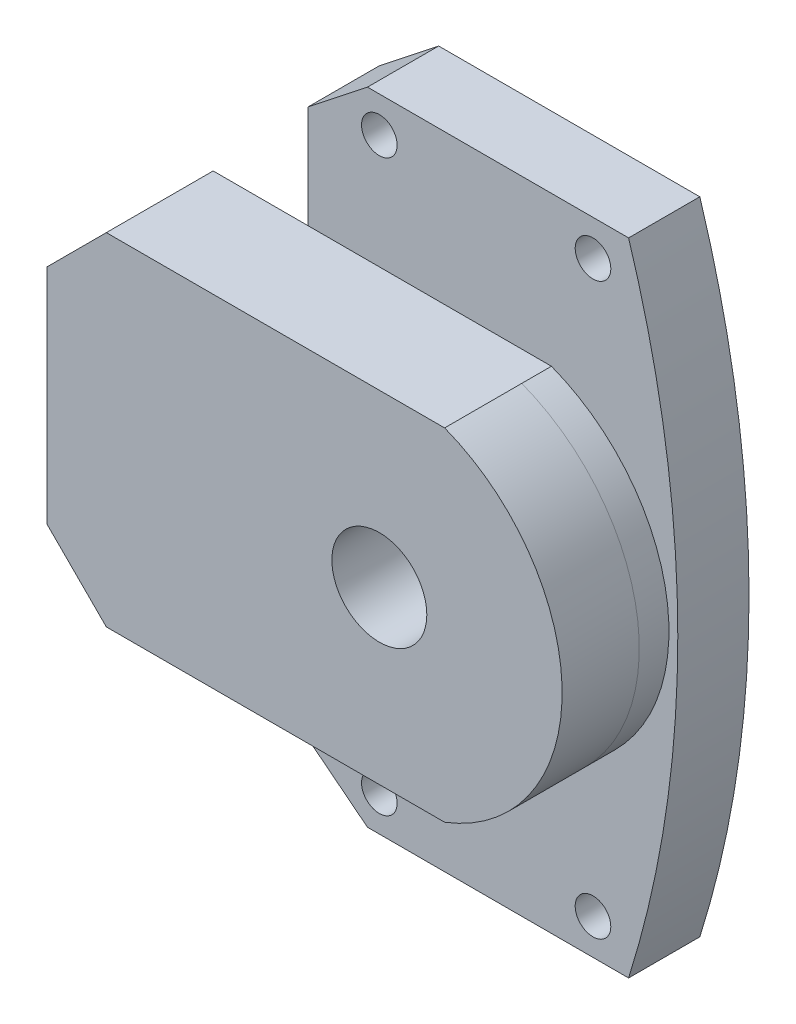
ISO-10303-21;
HEADER;
FILE_DESCRIPTION(('STEP AP214'),'2;1');
FILE_NAME('part.step','',(''),(''),'','','');
FILE_SCHEMA(('AUTOMOTIVE_DESIGN { 1 0 10303 214 1 1 1 1 }'));
ENDSEC;
DATA;
#1=APPLICATION_CONTEXT('core data for automotive mechanical design processes');
#2=APPLICATION_PROTOCOL_DEFINITION('international standard','automotive_design',2000,#1);
#3=PRODUCT_CONTEXT('',#1,'mechanical');
#4=PRODUCT('Part','Part','',(#3));
#5=PRODUCT_RELATED_PRODUCT_CATEGORY('part','',(#4));
#6=PRODUCT_DEFINITION_FORMATION('','',#4);
#7=PRODUCT_DEFINITION_CONTEXT('part definition',#1,'design');
#8=PRODUCT_DEFINITION('design','',#6,#7);
#9=PRODUCT_DEFINITION_SHAPE('','',#8);
#10=(LENGTH_UNIT() NAMED_UNIT(*) SI_UNIT(.MILLI.,.METRE.));
#11=(NAMED_UNIT(*) PLANE_ANGLE_UNIT() SI_UNIT($,.RADIAN.));
#12=(NAMED_UNIT(*) SI_UNIT($,.STERADIAN.) SOLID_ANGLE_UNIT());
#13=UNCERTAINTY_MEASURE_WITH_UNIT(LENGTH_MEASURE(1.E-05),#10,'distance_accuracy_value','');
#14=(GEOMETRIC_REPRESENTATION_CONTEXT(3) GLOBAL_UNCERTAINTY_ASSIGNED_CONTEXT((#13)) GLOBAL_UNIT_ASSIGNED_CONTEXT((#10,
#11,#12)) REPRESENTATION_CONTEXT('',''));
#15=CARTESIAN_POINT('',(0.,0.,0.));
#16=DIRECTION('',(0.,0.,1.));
#17=DIRECTION('',(1.,0.,0.));
#18=AXIS2_PLACEMENT_3D('',#15,#16,#17);
#19=CARTESIAN_POINT('',(-87.5169435511757,-10.5980462863294,-6.));
#20=DIRECTION('',(0.,0.,-1.));
#21=DIRECTION('',(-1.,0.,0.));
#22=AXIS2_PLACEMENT_3D('',#19,#20,#21);
#23=PLANE('',#22);
#24=CARTESIAN_POINT('',(-4.66241542365062,-34.5980462863294,-6.));
#25=DIRECTION('',(0.,0.,-1.));
#26=DIRECTION('',(1.,0.,0.));
#27=AXIS2_PLACEMENT_3D('',#24,#25,#26);
#28=CIRCLE('',#27,1.5);
#29=CARTESIAN_POINT('',(-3.16241542365062,-34.5980462863294,-6.));
#30=VERTEX_POINT('',#29);
#31=EDGE_CURVE('E207',#30,#30,#28,.T.);
#32=ORIENTED_EDGE('',*,*,#31,.F.);
#33=EDGE_LOOP('',(#32));
#34=FACE_BOUND('',#33,.T.);
#35=CARTESIAN_POINT('',(-4.66241542365062,13.4019537136706,-6.));
#36=DIRECTION('',(0.,0.,-1.));
#37=DIRECTION('',(-1.,0.,0.));
#38=AXIS2_PLACEMENT_3D('',#35,#36,#37);
#39=CIRCLE('',#38,1.5);
#40=CARTESIAN_POINT('',(-6.16241542365062,13.4019537136706,-6.));
#41=VERTEX_POINT('',#40);
#42=EDGE_CURVE('E219',#41,#41,#39,.T.);
#43=ORIENTED_EDGE('',*,*,#42,.F.);
#44=EDGE_LOOP('',(#43));
#45=FACE_BOUND('',#44,.T.);
#46=DIRECTION('',(-0.785278343538107,0.619142893983325,0.));
#47=VECTOR('',#46,1.);
#48=CARTESIAN_POINT('',(-28.6624154236506,-33.6558587863294,-6.));
#49=LINE('',#48,#47);
#50=CARTESIAN_POINT('',(-23.6624154236506,-37.5980462863294,-6.));
#51=VERTEX_POINT('',#50);
#52=CARTESIAN_POINT('',(-28.6624154236506,-33.6558587863294,-6.));
#53=VERTEX_POINT('',#52);
#54=EDGE_CURVE('E143',#51,#53,#49,.T.);
#55=ORIENTED_EDGE('',*,*,#54,.T.);
#56=DIRECTION('',(0.,1.,0.));
#57=VECTOR('',#56,1.);
#58=CARTESIAN_POINT('',(-28.6624154236506,12.4597662136706,-6.));
#59=LINE('',#58,#57);
#60=CARTESIAN_POINT('',(-28.6624154236506,12.4597662136706,-6.));
#61=VERTEX_POINT('',#60);
#62=EDGE_CURVE('E101',#53,#61,#59,.T.);
#63=ORIENTED_EDGE('',*,*,#62,.T.);
#64=DIRECTION('',(0.785278343538107,0.619142893983325,0.));
#65=VECTOR('',#64,1.);
#66=CARTESIAN_POINT('',(-23.6624154236506,16.4019537136706,-6.));
#67=LINE('',#66,#65);
#68=CARTESIAN_POINT('',(-23.6624154236506,16.4019537136706,-6.));
#69=VERTEX_POINT('',#68);
#70=EDGE_CURVE('E114',#61,#69,#67,.T.);
#71=ORIENTED_EDGE('',*,*,#70,.T.);
#72=DIRECTION('',(1.,0.,0.));
#73=VECTOR('',#72,1.);
#74=CARTESIAN_POINT('',(-23.6624154236506,16.4019537136706,-6.));
#75=LINE('',#74,#73);
#76=CARTESIAN_POINT('',(-1.66241542365062,16.4019537136706,-6.));
#77=VERTEX_POINT('',#76);
#78=EDGE_CURVE('E108',#69,#77,#75,.T.);
#79=ORIENTED_EDGE('',*,*,#78,.T.);
#80=CARTESIAN_POINT('',(-87.5169435511757,-10.5980462863294,-6.));
#81=DIRECTION('',(0.,0.,-1.));
#82=DIRECTION('',(-1.,0.,0.));
#83=AXIS2_PLACEMENT_3D('',#80,#81,#82);
#84=CIRCLE('',#83,90.);
#85=CARTESIAN_POINT('',(-1.66241542365062,-37.5980462863294,-6.));
#86=VERTEX_POINT('',#85);
#87=EDGE_CURVE('E112',#77,#86,#84,.T.);
#88=ORIENTED_EDGE('',*,*,#87,.T.);
#89=DIRECTION('',(-1.,0.,0.));
#90=VECTOR('',#89,1.);
#91=CARTESIAN_POINT('',(-23.6624154236506,-37.5980462863294,-6.));
#92=LINE('',#91,#90);
#93=EDGE_CURVE('E64',#86,#51,#92,.T.);
#94=ORIENTED_EDGE('',*,*,#93,.T.);
#95=EDGE_LOOP('',(#55,#63,#71,#79,#88,#94));
#96=FACE_BOUND('',#95,.T.);
#97=CARTESIAN_POINT('',(-13.6624154236506,-10.5980462863294,-6.));
#98=DIRECTION('',(0.,0.,-1.));
#99=DIRECTION('',(-1.,0.,0.));
#100=AXIS2_PLACEMENT_3D('',#97,#98,#99);
#101=CIRCLE('',#100,10.);
#102=CARTESIAN_POINT('',(-23.6624154236506,-10.5980462863294,-6.));
#103=VERTEX_POINT('',#102);
#104=EDGE_CURVE('E136',#103,#103,#101,.T.);
#105=ORIENTED_EDGE('',*,*,#104,.F.);
#106=EDGE_LOOP('',(#105));
#107=FACE_BOUND('',#106,.T.);
#108=CARTESIAN_POINT('',(-22.6624154236506,13.4019537136706,-6.));
#109=DIRECTION('',(0.,0.,-1.));
#110=DIRECTION('',(1.,0.,0.));
#111=AXIS2_PLACEMENT_3D('',#108,#109,#110);
#112=CIRCLE('',#111,1.5);
#113=CARTESIAN_POINT('',(-21.1624154236506,13.4019537136706,-6.));
#114=VERTEX_POINT('',#113);
#115=EDGE_CURVE('E213',#114,#114,#112,.T.);
#116=ORIENTED_EDGE('',*,*,#115,.F.);
#117=EDGE_LOOP('',(#116));
#118=FACE_BOUND('',#117,.T.);
#119=CARTESIAN_POINT('',(-22.6624154236506,-34.5980462863294,-6.));
#120=DIRECTION('',(0.,0.,-1.));
#121=DIRECTION('',(-1.,0.,0.));
#122=AXIS2_PLACEMENT_3D('',#119,#120,#121);
#123=CIRCLE('',#122,1.5);
#124=CARTESIAN_POINT('',(-24.1624154236506,-34.5980462863294,-6.));
#125=VERTEX_POINT('',#124);
#126=EDGE_CURVE('E198',#125,#125,#123,.T.);
#127=ORIENTED_EDGE('',*,*,#126,.F.);
#128=EDGE_LOOP('',(#127));
#129=FACE_BOUND('',#128,.T.);
#130=ADVANCED_FACE('F47',(#34,#45,#96,#107,#118,#129),#23,.T.);
#131=CARTESIAN_POINT('',(-87.5169435511757,-10.5980462863294,0.));
#132=DIRECTION('',(0.,0.,-1.));
#133=DIRECTION('',(-1.,0.,0.));
#134=AXIS2_PLACEMENT_3D('',#131,#132,#133);
#135=PLANE('',#134);
#136=DIRECTION('',(-0.785278343538107,0.619142893983325,0.));
#137=VECTOR('',#136,1.);
#138=CARTESIAN_POINT('',(-28.6624154236506,-33.6558587863294,0.));
#139=LINE('',#138,#137);
#140=CARTESIAN_POINT('',(-23.6624154236506,-37.5980462863294,0.));
#141=VERTEX_POINT('',#140);
#142=CARTESIAN_POINT('',(-28.6624154236506,-33.6558587863294,0.));
#143=VERTEX_POINT('',#142);
#144=EDGE_CURVE('E132',#141,#143,#139,.T.);
#145=ORIENTED_EDGE('',*,*,#144,.F.);
#146=DIRECTION('',(-1.,0.,0.));
#147=VECTOR('',#146,1.);
#148=CARTESIAN_POINT('',(-23.6624154236506,-37.5980462863294,0.));
#149=LINE('',#148,#147);
#150=CARTESIAN_POINT('',(-1.66241542365062,-37.5980462863294,0.));
#151=VERTEX_POINT('',#150);
#152=EDGE_CURVE('E93',#151,#141,#149,.T.);
#153=ORIENTED_EDGE('',*,*,#152,.F.);
#154=CARTESIAN_POINT('',(-87.5169435511757,-10.5980462863294,0.));
#155=DIRECTION('',(0.,0.,-1.));
#156=DIRECTION('',(-1.,0.,0.));
#157=AXIS2_PLACEMENT_3D('',#154,#155,#156);
#158=CIRCLE('',#157,90.);
#159=CARTESIAN_POINT('',(-1.66241542365062,16.4019537136706,0.));
#160=VERTEX_POINT('',#159);
#161=EDGE_CURVE('E87',#160,#151,#158,.T.);
#162=ORIENTED_EDGE('',*,*,#161,.F.);
#163=DIRECTION('',(1.,0.,0.));
#164=VECTOR('',#163,1.);
#165=CARTESIAN_POINT('',(-23.6624154236506,16.4019537136706,0.));
#166=LINE('',#165,#164);
#167=CARTESIAN_POINT('',(-23.6624154236506,16.4019537136706,0.));
#168=VERTEX_POINT('',#167);
#169=EDGE_CURVE('E122',#168,#160,#166,.T.);
#170=ORIENTED_EDGE('',*,*,#169,.F.);
#171=DIRECTION('',(0.785278343538107,0.619142893983325,0.));
#172=VECTOR('',#171,1.);
#173=CARTESIAN_POINT('',(-23.6624154236506,16.4019537136706,0.));
#174=LINE('',#173,#172);
#175=CARTESIAN_POINT('',(-28.6624154236506,12.4597662136706,0.));
#176=VERTEX_POINT('',#175);
#177=EDGE_CURVE('E138',#176,#168,#174,.T.);
#178=ORIENTED_EDGE('',*,*,#177,.F.);
#179=DIRECTION('',(0.,1.,0.));
#180=VECTOR('',#179,1.);
#181=CARTESIAN_POINT('',(-28.6624154236506,12.4597662136706,0.));
#182=LINE('',#181,#180);
#183=EDGE_CURVE('E135',#143,#176,#182,.T.);
#184=ORIENTED_EDGE('',*,*,#183,.F.);
#185=EDGE_LOOP('',(#145,#153,#162,#170,#178,#184));
#186=FACE_BOUND('',#185,.T.);
#187=CARTESIAN_POINT('',(-13.6624154236506,-10.5980462863294,0.));
#188=DIRECTION('',(0.,0.,-1.));
#189=DIRECTION('',(-1.,0.,0.));
#190=AXIS2_PLACEMENT_3D('',#187,#188,#189);
#191=CIRCLE('',#190,10.);
#192=CARTESIAN_POINT('',(-23.6624154236506,-10.5980462863294,0.));
#193=VERTEX_POINT('',#192);
#194=EDGE_CURVE('E222',#193,#193,#191,.T.);
#195=ORIENTED_EDGE('',*,*,#194,.T.);
#196=EDGE_LOOP('',(#195));
#197=FACE_BOUND('',#196,.T.);
#198=CARTESIAN_POINT('',(-4.66241542365062,13.4019537136706,0.));
#199=DIRECTION('',(0.,0.,-1.));
#200=DIRECTION('',(-1.,0.,0.));
#201=AXIS2_PLACEMENT_3D('',#198,#199,#200);
#202=CIRCLE('',#201,1.5);
#203=CARTESIAN_POINT('',(-6.16241542365062,13.4019537136706,0.));
#204=VERTEX_POINT('',#203);
#205=EDGE_CURVE('E216',#204,#204,#202,.T.);
#206=ORIENTED_EDGE('',*,*,#205,.T.);
#207=EDGE_LOOP('',(#206));
#208=FACE_BOUND('',#207,.T.);
#209=CARTESIAN_POINT('',(-22.6624154236506,13.4019537136706,0.));
#210=DIRECTION('',(0.,0.,-1.));
#211=DIRECTION('',(1.,0.,0.));
#212=AXIS2_PLACEMENT_3D('',#209,#210,#211);
#213=CIRCLE('',#212,1.5);
#214=CARTESIAN_POINT('',(-21.1624154236506,13.4019537136706,0.));
#215=VERTEX_POINT('',#214);
#216=EDGE_CURVE('E210',#215,#215,#213,.T.);
#217=ORIENTED_EDGE('',*,*,#216,.T.);
#218=EDGE_LOOP('',(#217));
#219=FACE_BOUND('',#218,.T.);
#220=CARTESIAN_POINT('',(-4.66241542365062,-34.5980462863294,0.));
#221=DIRECTION('',(0.,0.,-1.));
#222=DIRECTION('',(1.,0.,0.));
#223=AXIS2_PLACEMENT_3D('',#220,#221,#222);
#224=CIRCLE('',#223,1.5);
#225=CARTESIAN_POINT('',(-3.16241542365062,-34.5980462863294,0.));
#226=VERTEX_POINT('',#225);
#227=EDGE_CURVE('E204',#226,#226,#224,.T.);
#228=ORIENTED_EDGE('',*,*,#227,.T.);
#229=EDGE_LOOP('',(#228));
#230=FACE_BOUND('',#229,.T.);
#231=CARTESIAN_POINT('',(-22.6624154236506,-34.5980462863294,0.));
#232=DIRECTION('',(0.,0.,-1.));
#233=DIRECTION('',(-1.,0.,0.));
#234=AXIS2_PLACEMENT_3D('',#231,#232,#233);
#235=CIRCLE('',#234,1.5);
#236=CARTESIAN_POINT('',(-24.1624154236506,-34.5980462863294,0.));
#237=VERTEX_POINT('',#236);
#238=EDGE_CURVE('E201',#237,#237,#235,.T.);
#239=ORIENTED_EDGE('',*,*,#238,.T.);
#240=EDGE_LOOP('',(#239));
#241=FACE_BOUND('',#240,.T.);
#242=ADVANCED_FACE('F152',(#186,#197,#208,#219,#230,#241),#135,.F.);
#243=CARTESIAN_POINT('',(-28.6624154236506,-33.6558587863294,-6.));
#244=DIRECTION('',(0.619142893983325,0.785278343538107,0.));
#245=DIRECTION('',(-0.785278343538107,0.619142893983325,0.));
#246=AXIS2_PLACEMENT_3D('',#243,#244,#245);
#247=PLANE('',#246);
#248=ORIENTED_EDGE('',*,*,#144,.T.);
#249=DIRECTION('',(0.,0.,1.));
#250=VECTOR('',#249,1.);
#251=CARTESIAN_POINT('',(-28.6624154236506,-33.6558587863294,-6.));
#252=LINE('',#251,#250);
#253=EDGE_CURVE('E12',#53,#143,#252,.T.);
#254=ORIENTED_EDGE('',*,*,#253,.F.);
#255=ORIENTED_EDGE('',*,*,#54,.F.);
#256=DIRECTION('',(0.,0.,1.));
#257=VECTOR('',#256,1.);
#258=CARTESIAN_POINT('',(-23.6624154236506,-37.5980462863294,-6.));
#259=LINE('',#258,#257);
#260=EDGE_CURVE('E128',#51,#141,#259,.T.);
#261=ORIENTED_EDGE('',*,*,#260,.T.);
#262=EDGE_LOOP('',(#248,#254,#255,#261));
#263=FACE_BOUND('',#262,.T.);
#264=ADVANCED_FACE('F49',(#263),#247,.F.);
#265=CARTESIAN_POINT('',(-28.6624154236506,12.4597662136706,-6.));
#266=DIRECTION('',(1.,0.,0.));
#267=DIRECTION('',(0.,1.,0.));
#268=AXIS2_PLACEMENT_3D('',#265,#266,#267);
#269=PLANE('',#268);
#270=ORIENTED_EDGE('',*,*,#183,.T.);
#271=DIRECTION('',(0.,0.,1.));
#272=VECTOR('',#271,1.);
#273=CARTESIAN_POINT('',(-28.6624154236506,12.4597662136706,-6.));
#274=LINE('',#273,#272);
#275=EDGE_CURVE('E56',#61,#176,#274,.T.);
#276=ORIENTED_EDGE('',*,*,#275,.F.);
#277=ORIENTED_EDGE('',*,*,#62,.F.);
#278=ORIENTED_EDGE('',*,*,#253,.T.);
#279=EDGE_LOOP('',(#270,#276,#277,#278));
#280=FACE_BOUND('',#279,.T.);
#281=ADVANCED_FACE('F289',(#280),#269,.F.);
#282=CARTESIAN_POINT('',(-23.6624154236506,16.4019537136706,-6.));
#283=DIRECTION('',(0.619142893983325,-0.785278343538107,0.));
#284=DIRECTION('',(0.785278343538107,0.619142893983325,0.));
#285=AXIS2_PLACEMENT_3D('',#282,#283,#284);
#286=PLANE('',#285);
#287=ORIENTED_EDGE('',*,*,#177,.T.);
#288=DIRECTION('',(0.,0.,1.));
#289=VECTOR('',#288,1.);
#290=CARTESIAN_POINT('',(-23.6624154236506,16.4019537136706,-6.));
#291=LINE('',#290,#289);
#292=EDGE_CURVE('E123',#69,#168,#291,.T.);
#293=ORIENTED_EDGE('',*,*,#292,.F.);
#294=ORIENTED_EDGE('',*,*,#70,.F.);
#295=ORIENTED_EDGE('',*,*,#275,.T.);
#296=EDGE_LOOP('',(#287,#293,#294,#295));
#297=FACE_BOUND('',#296,.T.);
#298=ADVANCED_FACE('F149',(#297),#286,.F.);
#299=CARTESIAN_POINT('',(-23.6624154236506,16.4019537136706,-6.));
#300=DIRECTION('',(0.,-1.,0.));
#301=DIRECTION('',(1.,0.,0.));
#302=AXIS2_PLACEMENT_3D('',#299,#300,#301);
#303=PLANE('',#302);
#304=ORIENTED_EDGE('',*,*,#169,.T.);
#305=DIRECTION('',(0.,0.,1.));
#306=VECTOR('',#305,1.);
#307=CARTESIAN_POINT('',(-1.66241542365062,16.4019537136706,-6.));
#308=LINE('',#307,#306);
#309=EDGE_CURVE('E119',#77,#160,#308,.T.);
#310=ORIENTED_EDGE('',*,*,#309,.F.);
#311=ORIENTED_EDGE('',*,*,#78,.F.);
#312=ORIENTED_EDGE('',*,*,#292,.T.);
#313=EDGE_LOOP('',(#304,#310,#311,#312));
#314=FACE_BOUND('',#313,.T.);
#315=ADVANCED_FACE('F120',(#314),#303,.F.);
#316=CARTESIAN_POINT('',(-87.5169435511757,-10.5980462863294,-6.));
#317=DIRECTION('',(0.,0.,1.));
#318=DIRECTION('',(1.,0.,0.));
#319=AXIS2_PLACEMENT_3D('',#316,#317,#318);
#320=CYLINDRICAL_SURFACE('',#319,90.);
#321=ORIENTED_EDGE('',*,*,#161,.T.);
#322=DIRECTION('',(0.,0.,1.));
#323=VECTOR('',#322,1.);
#324=CARTESIAN_POINT('',(-1.66241542365062,-37.5980462863294,-6.));
#325=LINE('',#324,#323);
#326=EDGE_CURVE('E124',#86,#151,#325,.T.);
#327=ORIENTED_EDGE('',*,*,#326,.F.);
#328=ORIENTED_EDGE('',*,*,#87,.F.);
#329=ORIENTED_EDGE('',*,*,#309,.T.);
#330=EDGE_LOOP('',(#321,#327,#328,#329));
#331=FACE_BOUND('',#330,.T.);
#332=ADVANCED_FACE('F126',(#331),#320,.T.);
#333=CARTESIAN_POINT('',(-23.6624154236506,-37.5980462863294,-6.));
#334=DIRECTION('',(0.,1.,0.));
#335=DIRECTION('',(-1.,0.,0.));
#336=AXIS2_PLACEMENT_3D('',#333,#334,#335);
#337=PLANE('',#336);
#338=ORIENTED_EDGE('',*,*,#152,.T.);
#339=ORIENTED_EDGE('',*,*,#260,.F.);
#340=ORIENTED_EDGE('',*,*,#93,.F.);
#341=ORIENTED_EDGE('',*,*,#326,.T.);
#342=EDGE_LOOP('',(#338,#339,#340,#341));
#343=FACE_BOUND('',#342,.T.);
#344=ADVANCED_FACE('F157',(#343),#337,.F.);
#345=CARTESIAN_POINT('',(-13.6624154236506,-10.5980462863294,-6.));
#346=DIRECTION('',(0.,0.,1.));
#347=DIRECTION('',(1.,0.,0.));
#348=AXIS2_PLACEMENT_3D('',#345,#346,#347);
#349=CYLINDRICAL_SURFACE('',#348,10.);
#350=ORIENTED_EDGE('',*,*,#104,.T.);
#351=EDGE_LOOP('',(#350));
#352=FACE_BOUND('',#351,.T.);
#353=ORIENTED_EDGE('',*,*,#194,.F.);
#354=EDGE_LOOP('',(#353));
#355=FACE_BOUND('',#354,.T.);
#356=ADVANCED_FACE('F159',(#352,#355),#349,.F.);
#357=CARTESIAN_POINT('',(-4.66241542365062,13.4019537136706,-6.));
#358=DIRECTION('',(0.,0.,1.));
#359=DIRECTION('',(1.,0.,0.));
#360=AXIS2_PLACEMENT_3D('',#357,#358,#359);
#361=CYLINDRICAL_SURFACE('',#360,1.5);
#362=ORIENTED_EDGE('',*,*,#42,.T.);
#363=EDGE_LOOP('',(#362));
#364=FACE_BOUND('',#363,.T.);
#365=ORIENTED_EDGE('',*,*,#205,.F.);
#366=EDGE_LOOP('',(#365));
#367=FACE_BOUND('',#366,.T.);
#368=ADVANCED_FACE('F165',(#364,#367),#361,.F.);
#369=CARTESIAN_POINT('',(-22.6624154236506,13.4019537136706,-6.));
#370=DIRECTION('',(0.,0.,1.));
#371=DIRECTION('',(1.,0.,0.));
#372=AXIS2_PLACEMENT_3D('',#369,#370,#371);
#373=CYLINDRICAL_SURFACE('',#372,1.5);
#374=ORIENTED_EDGE('',*,*,#115,.T.);
#375=EDGE_LOOP('',(#374));
#376=FACE_BOUND('',#375,.T.);
#377=ORIENTED_EDGE('',*,*,#216,.F.);
#378=EDGE_LOOP('',(#377));
#379=FACE_BOUND('',#378,.T.);
#380=ADVANCED_FACE('F181',(#376,#379),#373,.F.);
#381=CARTESIAN_POINT('',(-4.66241542365062,-34.5980462863294,-6.));
#382=DIRECTION('',(0.,0.,1.));
#383=DIRECTION('',(1.,0.,0.));
#384=AXIS2_PLACEMENT_3D('',#381,#382,#383);
#385=CYLINDRICAL_SURFACE('',#384,1.5);
#386=ORIENTED_EDGE('',*,*,#31,.T.);
#387=EDGE_LOOP('',(#386));
#388=FACE_BOUND('',#387,.T.);
#389=ORIENTED_EDGE('',*,*,#227,.F.);
#390=EDGE_LOOP('',(#389));
#391=FACE_BOUND('',#390,.T.);
#392=ADVANCED_FACE('F185',(#388,#391),#385,.F.);
#393=CARTESIAN_POINT('',(-22.6624154236506,-34.5980462863294,-6.));
#394=DIRECTION('',(0.,0.,1.));
#395=DIRECTION('',(1.,0.,0.));
#396=AXIS2_PLACEMENT_3D('',#393,#394,#395);
#397=CYLINDRICAL_SURFACE('',#396,1.5);
#398=ORIENTED_EDGE('',*,*,#126,.T.);
#399=EDGE_LOOP('',(#398));
#400=FACE_BOUND('',#399,.T.);
#401=ORIENTED_EDGE('',*,*,#238,.F.);
#402=EDGE_LOOP('',(#401));
#403=FACE_BOUND('',#402,.T.);
#404=ADVANCED_FACE('F189',(#400,#403),#397,.F.);
#405=CLOSED_SHELL('',(#130,#242,#264,#281,#298,#315,#332,#344,#356,#368,#380,#392,#404));
#406=MANIFOLD_SOLID_BREP('B2',#405);
#407=CARTESIAN_POINT('',(-13.6624154236506,-10.5980462863294,1.74455679792347E-13));
#408=DIRECTION('',(0.,0.,1.));
#409=DIRECTION('',(1.,0.,0.));
#410=AXIS2_PLACEMENT_3D('',#407,#408,#409);
#411=PLANE('',#410);
#412=DIRECTION('',(-0.707106781186547,-0.707106781186548,0.));
#413=VECTOR('',#412,1.);
#414=CARTESIAN_POINT('',(-36.6624154236506,3.78695371367061,1.74455679792347E-13));
#415=LINE('',#414,#413);
#416=CARTESIAN_POINT('',(-36.6624154236506,3.78695371367061,1.74455679792347E-13));
#417=VERTEX_POINT('',#416);
#418=CARTESIAN_POINT('',(-41.6624154236506,-1.21304628632939,1.74455679792347E-13));
#419=VERTEX_POINT('',#418);
#420=EDGE_CURVE('E387',#417,#419,#415,.T.);
#421=ORIENTED_EDGE('',*,*,#420,.F.);
#422=DIRECTION('',(-1.,0.,0.));
#423=VECTOR('',#422,1.);
#424=CARTESIAN_POINT('',(-19.1624154236506,3.78695371367061,1.74455679792347E-13));
#425=LINE('',#424,#423);
#426=CARTESIAN_POINT('',(-8.16241542365062,3.78695371367061,1.74455679792347E-13));
#427=VERTEX_POINT('',#426);
#428=EDGE_CURVE('E371',#427,#417,#425,.T.);
#429=ORIENTED_EDGE('',*,*,#428,.F.);
#430=CARTESIAN_POINT('',(-13.6624154236506,-10.5980462863294,1.74455679792347E-13));
#431=DIRECTION('',(0.,0.,1.));
#432=DIRECTION('',(1.,0.,0.));
#433=AXIS2_PLACEMENT_3D('',#430,#431,#432);
#434=CIRCLE('',#433,15.4005917094117);
#435=CARTESIAN_POINT('',(-8.16241542365062,-24.9830462863294,1.74455679792347E-13));
#436=VERTEX_POINT('',#435);
#437=EDGE_CURVE('E381',#436,#427,#434,.T.);
#438=ORIENTED_EDGE('',*,*,#437,.F.);
#439=DIRECTION('',(1.,0.,0.));
#440=VECTOR('',#439,1.);
#441=CARTESIAN_POINT('',(-19.1624154236506,-24.9830462863294,1.74455679792347E-13));
#442=LINE('',#441,#440);
#443=CARTESIAN_POINT('',(-36.6624154236506,-24.9830462863294,1.74455679792347E-13));
#444=VERTEX_POINT('',#443);
#445=EDGE_CURVE('E405',#444,#436,#442,.T.);
#446=ORIENTED_EDGE('',*,*,#445,.F.);
#447=DIRECTION('',(0.707106781186548,-0.707106781186547,0.));
#448=VECTOR('',#447,1.);
#449=CARTESIAN_POINT('',(-41.6624154236506,-19.9830462863294,1.74455679792347E-13));
#450=LINE('',#449,#448);
#451=CARTESIAN_POINT('',(-41.6624154236506,-19.9830462863294,1.74455679792347E-13));
#452=VERTEX_POINT('',#451);
#453=EDGE_CURVE('E396',#452,#444,#450,.T.);
#454=ORIENTED_EDGE('',*,*,#453,.F.);
#455=DIRECTION('',(0.,-1.,0.));
#456=VECTOR('',#455,1.);
#457=CARTESIAN_POINT('',(-41.6624154236506,-1.21304628632939,1.74455679792347E-13));
#458=LINE('',#457,#456);
#459=EDGE_CURVE('E393',#419,#452,#458,.T.);
#460=ORIENTED_EDGE('',*,*,#459,.F.);
#461=EDGE_LOOP('',(#421,#429,#438,#446,#454,#460));
#462=FACE_BOUND('',#461,.T.);
#463=CARTESIAN_POINT('',(-29.4124154236506,-21.0780462863294,1.74455679792347E-13));
#464=DIRECTION('',(0.,0.,1.));
#465=DIRECTION('',(1.,0.,0.));
#466=AXIS2_PLACEMENT_3D('',#463,#464,#465);
#467=CIRCLE('',#466,1.98);
#468=CARTESIAN_POINT('',(-27.4324154236506,-21.0780462863294,1.74455679792347E-13));
#469=VERTEX_POINT('',#468);
#470=EDGE_CURVE('E394',#469,#469,#467,.T.);
#471=ORIENTED_EDGE('',*,*,#470,.T.);
#472=EDGE_LOOP('',(#471));
#473=FACE_BOUND('',#472,.T.);
#474=CARTESIAN_POINT('',(-29.4124154236506,-0.118046286329387,1.74455679792347E-13));
#475=DIRECTION('',(0.,0.,1.));
#476=DIRECTION('',(1.,0.,0.));
#477=AXIS2_PLACEMENT_3D('',#474,#475,#476);
#478=CIRCLE('',#477,1.98);
#479=CARTESIAN_POINT('',(-27.4324154236506,-0.118046286329387,1.74455679792347E-13));
#480=VERTEX_POINT('',#479);
#481=EDGE_CURVE('E399',#480,#480,#478,.T.);
#482=ORIENTED_EDGE('',*,*,#481,.T.);
#483=EDGE_LOOP('',(#482));
#484=FACE_BOUND('',#483,.T.);
#485=CARTESIAN_POINT('',(-13.6624154236506,-10.5980462863294,1.74455679792347E-13));
#486=DIRECTION('',(0.,0.,1.));
#487=DIRECTION('',(1.,0.,0.));
#488=AXIS2_PLACEMENT_3D('',#485,#486,#487);
#489=CIRCLE('',#488,6.3);
#490=CARTESIAN_POINT('',(-7.36241542365062,-10.5980462863294,1.74455679792347E-13));
#491=VERTEX_POINT('',#490);
#492=EDGE_CURVE('E580',#491,#491,#489,.T.);
#493=ORIENTED_EDGE('',*,*,#492,.T.);
#494=EDGE_LOOP('',(#493));
#495=FACE_BOUND('',#494,.T.);
#496=CARTESIAN_POINT('',(-13.6624154236506,-1.07304628632939,1.74455679792347E-13));
#497=DIRECTION('',(0.,0.,1.));
#498=DIRECTION('',(1.,0.,0.));
#499=AXIS2_PLACEMENT_3D('',#496,#497,#498);
#500=CIRCLE('',#499,1.475);
#501=CARTESIAN_POINT('',(-12.1874154236506,-1.07304628632939,1.74455679792347E-13));
#502=VERTEX_POINT('',#501);
#503=EDGE_CURVE('E577',#502,#502,#500,.T.);
#504=ORIENTED_EDGE('',*,*,#503,.T.);
#505=EDGE_LOOP('',(#504));
#506=FACE_BOUND('',#505,.T.);
#507=CARTESIAN_POINT('',(-13.6624154236506,-20.1230462863294,1.74455679792347E-13));
#508=DIRECTION('',(0.,0.,1.));
#509=DIRECTION('',(1.,0.,0.));
#510=AXIS2_PLACEMENT_3D('',#507,#508,#509);
#511=CIRCLE('',#510,1.475);
#512=CARTESIAN_POINT('',(-12.1874154236506,-20.1230462863294,1.74455679792347E-13));
#513=VERTEX_POINT('',#512);
#514=EDGE_CURVE('E574',#513,#513,#511,.T.);
#515=ORIENTED_EDGE('',*,*,#514,.T.);
#516=EDGE_LOOP('',(#515));
#517=FACE_BOUND('',#516,.T.);
#518=CARTESIAN_POINT('',(-4.6821593025815,-19.5783024073986,1.74455679792347E-13));
#519=DIRECTION('',(0.,0.,1.));
#520=DIRECTION('',(1.,0.,0.));
#521=AXIS2_PLACEMENT_3D('',#518,#519,#520);
#522=CIRCLE('',#521,1.98000000000002);
#523=CARTESIAN_POINT('',(-2.70215930258148,-19.5783024073986,1.74455679792347E-13));
#524=VERTEX_POINT('',#523);
#525=EDGE_CURVE('E571',#524,#524,#522,.T.);
#526=ORIENTED_EDGE('',*,*,#525,.T.);
#527=EDGE_LOOP('',(#526));
#528=FACE_BOUND('',#527,.T.);
#529=CARTESIAN_POINT('',(-4.6821593025815,-1.61779016526022,1.74455679792347E-13));
#530=DIRECTION('',(0.,0.,1.));
#531=DIRECTION('',(1.,0.,0.));
#532=AXIS2_PLACEMENT_3D('',#529,#530,#531);
#533=CIRCLE('',#532,1.98000000000002);
#534=CARTESIAN_POINT('',(-2.70215930258148,-1.61779016526022,1.74455679792347E-13));
#535=VERTEX_POINT('',#534);
#536=EDGE_CURVE('E568',#535,#535,#533,.T.);
#537=ORIENTED_EDGE('',*,*,#536,.T.);
#538=EDGE_LOOP('',(#537));
#539=FACE_BOUND('',#538,.T.);
#540=CARTESIAN_POINT('',(-22.6426715447198,-1.61779016526022,1.74455679792347E-13));
#541=DIRECTION('',(0.,0.,1.));
#542=DIRECTION('',(1.,0.,0.));
#543=AXIS2_PLACEMENT_3D('',#540,#541,#542);
#544=CIRCLE('',#543,1.05);
#545=CARTESIAN_POINT('',(-21.5926715447198,-1.61779016526022,1.74455679792347E-13));
#546=VERTEX_POINT('',#545);
#547=EDGE_CURVE('E565',#546,#546,#544,.T.);
#548=ORIENTED_EDGE('',*,*,#547,.T.);
#549=EDGE_LOOP('',(#548));
#550=FACE_BOUND('',#549,.T.);
#551=CARTESIAN_POINT('',(-22.6426715447198,-19.5783024073986,1.74455679792347E-13));
#552=DIRECTION('',(0.,0.,1.));
#553=DIRECTION('',(1.,0.,0.));
#554=AXIS2_PLACEMENT_3D('',#551,#552,#553);
#555=CIRCLE('',#554,1.05);
#556=CARTESIAN_POINT('',(-21.5926715447198,-19.5783024073986,1.74455679792347E-13));
#557=VERTEX_POINT('',#556);
#558=EDGE_CURVE('E562',#557,#557,#555,.T.);
#559=ORIENTED_EDGE('',*,*,#558,.T.);
#560=EDGE_LOOP('',(#559));
#561=FACE_BOUND('',#560,.T.);
#562=CARTESIAN_POINT('',(-17.6624154236506,-3.66984305605386,1.74455679792347E-13));
#563=DIRECTION('',(0.,0.,1.));
#564=DIRECTION('',(1.,0.,0.));
#565=AXIS2_PLACEMENT_3D('',#562,#563,#564);
#566=CIRCLE('',#565,0.85);
#567=CARTESIAN_POINT('',(-16.8124154236506,-3.66984305605386,1.74455679792347E-13));
#568=VERTEX_POINT('',#567);
#569=EDGE_CURVE('E559',#568,#568,#566,.T.);
#570=ORIENTED_EDGE('',*,*,#569,.T.);
#571=EDGE_LOOP('',(#570));
#572=FACE_BOUND('',#571,.T.);
#573=CARTESIAN_POINT('',(-9.66241542365067,-17.5262495166049,1.74455679792347E-13));
#574=DIRECTION('',(0.,0.,1.));
#575=DIRECTION('',(1.,0.,0.));
#576=AXIS2_PLACEMENT_3D('',#573,#574,#575);
#577=CIRCLE('',#576,0.85);
#578=CARTESIAN_POINT('',(-8.81241542365067,-17.5262495166049,1.74455679792347E-13));
#579=VERTEX_POINT('',#578);
#580=EDGE_CURVE('E556',#579,#579,#577,.T.);
#581=ORIENTED_EDGE('',*,*,#580,.T.);
#582=EDGE_LOOP('',(#581));
#583=FACE_BOUND('',#582,.T.);
#584=ADVANCED_FACE('F328',(#462,#473,#484,#495,#506,#517,#528,#539,#550,#561,#572,#583),#411,.F.);
#585=CARTESIAN_POINT('',(-36.6624154236506,3.78695371367061,2.50000000000017));
#586=DIRECTION('',(0.707106781186548,-0.707106781186547,0.));
#587=DIRECTION('',(0.707106781186547,0.707106781186548,0.));
#588=AXIS2_PLACEMENT_3D('',#585,#586,#587);
#589=PLANE('',#588);
#590=ORIENTED_EDGE('',*,*,#420,.T.);
#591=DIRECTION('',(0.,0.,-1.));
#592=VECTOR('',#591,1.);
#593=CARTESIAN_POINT('',(-41.6624154236506,-1.21304628632939,2.50000000000017));
#594=LINE('',#593,#592);
#595=CARTESIAN_POINT('',(-41.6624154236506,-1.21304628632939,9.00000000000017));
#596=VERTEX_POINT('',#595);
#597=EDGE_CURVE('E45',#596,#419,#594,.T.);
#598=ORIENTED_EDGE('',*,*,#597,.F.);
#599=DIRECTION('',(-0.707106781186547,-0.707106781186548,0.));
#600=VECTOR('',#599,1.);
#601=CARTESIAN_POINT('',(-36.6624154236506,3.78695371367061,9.00000000000017));
#602=LINE('',#601,#600);
#603=CARTESIAN_POINT('',(-36.6624154236506,3.78695371367061,9.00000000000017));
#604=VERTEX_POINT('',#603);
#605=EDGE_CURVE('E389',#604,#596,#602,.T.);
#606=ORIENTED_EDGE('',*,*,#605,.F.);
#607=DIRECTION('',(0.,0.,-1.));
#608=VECTOR('',#607,1.);
#609=CARTESIAN_POINT('',(-36.6624154236506,3.78695371367061,2.50000000000017));
#610=LINE('',#609,#608);
#611=EDGE_CURVE('E377',#604,#417,#610,.T.);
#612=ORIENTED_EDGE('',*,*,#611,.T.);
#613=EDGE_LOOP('',(#590,#598,#606,#612));
#614=FACE_BOUND('',#613,.T.);
#615=ADVANCED_FACE('F330',(#614),#589,.F.);
#616=CARTESIAN_POINT('',(-41.6624154236506,-1.21304628632939,2.50000000000017));
#617=DIRECTION('',(1.,0.,0.));
#618=DIRECTION('',(0.,1.,0.));
#619=AXIS2_PLACEMENT_3D('',#616,#617,#618);
#620=PLANE('',#619);
#621=ORIENTED_EDGE('',*,*,#459,.T.);
#622=DIRECTION('',(0.,0.,-1.));
#623=VECTOR('',#622,1.);
#624=CARTESIAN_POINT('',(-41.6624154236506,-19.9830462863294,2.50000000000017));
#625=LINE('',#624,#623);
#626=CARTESIAN_POINT('',(-41.6624154236506,-19.9830462863294,9.00000000000017));
#627=VERTEX_POINT('',#626);
#628=EDGE_CURVE('E338',#627,#452,#625,.T.);
#629=ORIENTED_EDGE('',*,*,#628,.F.);
#630=DIRECTION('',(0.,-1.,0.));
#631=VECTOR('',#630,1.);
#632=CARTESIAN_POINT('',(-41.6624154236506,-19.9830462863294,9.00000000000017));
#633=LINE('',#632,#631);
#634=EDGE_CURVE('E683',#596,#627,#633,.T.);
#635=ORIENTED_EDGE('',*,*,#634,.F.);
#636=ORIENTED_EDGE('',*,*,#597,.T.);
#637=EDGE_LOOP('',(#621,#629,#635,#636));
#638=FACE_BOUND('',#637,.T.);
#639=ADVANCED_FACE('F439',(#638),#620,.F.);
#640=CARTESIAN_POINT('',(-41.6624154236506,-19.9830462863294,2.50000000000017));
#641=DIRECTION('',(0.707106781186547,0.707106781186548,0.));
#642=DIRECTION('',(-0.707106781186548,0.707106781186547,0.));
#643=AXIS2_PLACEMENT_3D('',#640,#641,#642);
#644=PLANE('',#643);
#645=ORIENTED_EDGE('',*,*,#453,.T.);
#646=DIRECTION('',(0.,0.,-1.));
#647=VECTOR('',#646,1.);
#648=CARTESIAN_POINT('',(-36.6624154236506,-24.9830462863294,2.50000000000017));
#649=LINE('',#648,#647);
#650=CARTESIAN_POINT('',(-36.6624154236506,-24.9830462863294,9.00000000000017));
#651=VERTEX_POINT('',#650);
#652=EDGE_CURVE('E408',#651,#444,#649,.T.);
#653=ORIENTED_EDGE('',*,*,#652,.F.);
#654=DIRECTION('',(0.707106781186548,-0.707106781186547,0.));
#655=VECTOR('',#654,1.);
#656=CARTESIAN_POINT('',(-36.6624154236506,-24.9830462863294,9.00000000000017));
#657=LINE('',#656,#655);
#658=EDGE_CURVE('E690',#627,#651,#657,.T.);
#659=ORIENTED_EDGE('',*,*,#658,.F.);
#660=ORIENTED_EDGE('',*,*,#628,.T.);
#661=EDGE_LOOP('',(#645,#653,#659,#660));
#662=FACE_BOUND('',#661,.T.);
#663=ADVANCED_FACE('F436',(#662),#644,.F.);
#664=CARTESIAN_POINT('',(-19.1624154236506,-24.9830462863294,2.50000000000017));
#665=DIRECTION('',(0.,1.,0.));
#666=DIRECTION('',(0.,0.,1.));
#667=AXIS2_PLACEMENT_3D('',#664,#665,#666);
#668=PLANE('',#667);
#669=ORIENTED_EDGE('',*,*,#445,.T.);
#670=DIRECTION('',(0.,0.,-1.));
#671=VECTOR('',#670,1.);
#672=CARTESIAN_POINT('',(-8.16241542365062,-24.9830462863294,2.50000000000017));
#673=LINE('',#672,#671);
#674=CARTESIAN_POINT('',(-8.16241542365062,-24.9830462863294,2.50000000000017));
#675=VERTEX_POINT('',#674);
#676=EDGE_CURVE('E411',#675,#436,#673,.T.);
#677=ORIENTED_EDGE('',*,*,#676,.F.);
#678=DIRECTION('',(0.,0.,-1.));
#679=VECTOR('',#678,1.);
#680=CARTESIAN_POINT('',(-8.16241542365061,-24.9830462863294,9.00000000000017));
#681=LINE('',#680,#679);
#682=CARTESIAN_POINT('',(-8.16241542365061,-24.9830462863294,9.00000000000017));
#683=VERTEX_POINT('',#682);
#684=EDGE_CURVE('E509',#683,#675,#681,.T.);
#685=ORIENTED_EDGE('',*,*,#684,.F.);
#686=DIRECTION('',(1.,0.,0.));
#687=VECTOR('',#686,1.);
#688=CARTESIAN_POINT('',(-8.16241542365062,-24.9830462863294,9.00000000000017));
#689=LINE('',#688,#687);
#690=EDGE_CURVE('E693',#651,#683,#689,.T.);
#691=ORIENTED_EDGE('',*,*,#690,.F.);
#692=ORIENTED_EDGE('',*,*,#652,.T.);
#693=EDGE_LOOP('',(#669,#677,#685,#691,#692));
#694=FACE_BOUND('',#693,.T.);
#695=ADVANCED_FACE('F432',(#694),#668,.F.);
#696=CARTESIAN_POINT('',(-13.6624154236506,-10.5980462863294,2.50000000000017));
#697=DIRECTION('',(0.,0.,-1.));
#698=DIRECTION('',(-1.,0.,0.));
#699=AXIS2_PLACEMENT_3D('',#696,#697,#698);
#700=CYLINDRICAL_SURFACE('',#699,15.4005917094117);
#701=ORIENTED_EDGE('',*,*,#437,.T.);
#702=DIRECTION('',(0.,0.,-1.));
#703=VECTOR('',#702,1.);
#704=CARTESIAN_POINT('',(-8.16241542365062,3.78695371367061,2.50000000000017));
#705=LINE('',#704,#703);
#706=CARTESIAN_POINT('',(-8.16241542365062,3.78695371367061,2.50000000000017));
#707=VERTEX_POINT('',#706);
#708=EDGE_CURVE('E347',#707,#427,#705,.T.);
#709=ORIENTED_EDGE('',*,*,#708,.F.);
#710=CARTESIAN_POINT('',(-13.6625687683024,-10.5980462863294,2.50000000000018));
#711=DIRECTION('',(0.,0.,1.));
#712=DIRECTION('',(0.357137822361272,-0.934051698697159,0.));
#713=AXIS2_PLACEMENT_3D('',#710,#711,#712);
#714=CIRCLE('',#713,15.4006464739206);
#715=EDGE_CURVE('E380',#675,#707,#714,.T.);
#716=ORIENTED_EDGE('',*,*,#715,.F.);
#717=ORIENTED_EDGE('',*,*,#676,.T.);
#718=EDGE_LOOP('',(#701,#709,#716,#717));
#719=FACE_BOUND('',#718,.T.);
#720=ADVANCED_FACE('F422',(#719),#700,.T.);
#721=CARTESIAN_POINT('',(-19.1624154236506,3.78695371367061,2.50000000000017));
#722=DIRECTION('',(0.,-1.,0.));
#723=DIRECTION('',(0.,0.,-1.));
#724=AXIS2_PLACEMENT_3D('',#721,#722,#723);
#725=PLANE('',#724);
#726=ORIENTED_EDGE('',*,*,#428,.T.);
#727=ORIENTED_EDGE('',*,*,#611,.F.);
#728=DIRECTION('',(-1.,0.,0.));
#729=VECTOR('',#728,1.);
#730=CARTESIAN_POINT('',(-36.6624154236506,3.78695371367061,9.00000000000017));
#731=LINE('',#730,#729);
#732=CARTESIAN_POINT('',(-8.16241542365062,3.78695371367061,9.00000000000017));
#733=VERTEX_POINT('',#732);
#734=EDGE_CURVE('E521',#733,#604,#731,.T.);
#735=ORIENTED_EDGE('',*,*,#734,.F.);
#736=DIRECTION('',(0.,0.,-1.));
#737=VECTOR('',#736,1.);
#738=CARTESIAN_POINT('',(-8.16241542365062,3.78695371367061,9.00000000000017));
#739=LINE('',#738,#737);
#740=EDGE_CURVE('E517',#733,#707,#739,.T.);
#741=ORIENTED_EDGE('',*,*,#740,.T.);
#742=ORIENTED_EDGE('',*,*,#708,.T.);
#743=EDGE_LOOP('',(#726,#727,#735,#741,#742));
#744=FACE_BOUND('',#743,.T.);
#745=ADVANCED_FACE('F375',(#744),#725,.F.);
#746=CARTESIAN_POINT('',(-29.4124154236506,-21.0780462863294,2.50000000000017));
#747=DIRECTION('',(0.,0.,-1.));
#748=DIRECTION('',(-1.,0.,0.));
#749=AXIS2_PLACEMENT_3D('',#746,#747,#748);
#750=CYLINDRICAL_SURFACE('',#749,1.98);
#751=CARTESIAN_POINT('',(-29.4124154236506,-21.0780462863294,2.50000000000017));
#752=DIRECTION('',(0.,0.,-1.));
#753=DIRECTION('',(-1.,0.,0.));
#754=AXIS2_PLACEMENT_3D('',#751,#752,#753);
#755=CIRCLE('',#754,1.98);
#756=CARTESIAN_POINT('',(-31.3924154236506,-21.0780462863294,2.50000000000017));
#757=VERTEX_POINT('',#756);
#758=EDGE_CURVE('E553',#757,#757,#755,.T.);
#759=ORIENTED_EDGE('',*,*,#758,.F.);
#760=EDGE_LOOP('',(#759));
#761=FACE_BOUND('',#760,.T.);
#762=ORIENTED_EDGE('',*,*,#470,.F.);
#763=EDGE_LOOP('',(#762));
#764=FACE_BOUND('',#763,.T.);
#765=ADVANCED_FACE('F450',(#761,#764),#750,.F.);
#766=CARTESIAN_POINT('',(-29.4124154236506,-0.118046286329387,2.50000000000017));
#767=DIRECTION('',(0.,0.,-1.));
#768=DIRECTION('',(-1.,0.,0.));
#769=AXIS2_PLACEMENT_3D('',#766,#767,#768);
#770=CYLINDRICAL_SURFACE('',#769,1.98);
#771=CARTESIAN_POINT('',(-29.4124154236506,-0.118046286329387,2.50000000000017));
#772=DIRECTION('',(0.,0.,-1.));
#773=DIRECTION('',(-1.,0.,0.));
#774=AXIS2_PLACEMENT_3D('',#771,#772,#773);
#775=CIRCLE('',#774,1.98);
#776=CARTESIAN_POINT('',(-31.3924154236506,-0.118046286329387,2.50000000000017));
#777=VERTEX_POINT('',#776);
#778=EDGE_CURVE('E550',#777,#777,#775,.T.);
#779=ORIENTED_EDGE('',*,*,#778,.F.);
#780=EDGE_LOOP('',(#779));
#781=FACE_BOUND('',#780,.T.);
#782=ORIENTED_EDGE('',*,*,#481,.F.);
#783=EDGE_LOOP('',(#782));
#784=FACE_BOUND('',#783,.T.);
#785=ADVANCED_FACE('F453',(#781,#784),#770,.F.);
#786=CARTESIAN_POINT('',(-13.6624154236506,-10.5980462863294,2.50000000000017));
#787=DIRECTION('',(0.,0.,-1.));
#788=DIRECTION('',(-1.,0.,0.));
#789=AXIS2_PLACEMENT_3D('',#786,#787,#788);
#790=CYLINDRICAL_SURFACE('',#789,6.3);
#791=CARTESIAN_POINT('',(-13.6624154236506,-10.5980462863294,2.50000000000017));
#792=DIRECTION('',(0.,0.,-1.));
#793=DIRECTION('',(-1.,0.,0.));
#794=AXIS2_PLACEMENT_3D('',#791,#792,#793);
#795=CIRCLE('',#794,6.3);
#796=CARTESIAN_POINT('',(-19.9624154236506,-10.5980462863294,2.50000000000017));
#797=VERTEX_POINT('',#796);
#798=EDGE_CURVE('E547',#797,#797,#795,.T.);
#799=ORIENTED_EDGE('',*,*,#798,.F.);
#800=EDGE_LOOP('',(#799));
#801=FACE_BOUND('',#800,.T.);
#802=ORIENTED_EDGE('',*,*,#492,.F.);
#803=EDGE_LOOP('',(#802));
#804=FACE_BOUND('',#803,.T.);
#805=ADVANCED_FACE('F457',(#801,#804),#790,.F.);
#806=CARTESIAN_POINT('',(-13.6624154236506,-1.07304628632939,2.50000000000017));
#807=DIRECTION('',(0.,0.,-1.));
#808=DIRECTION('',(-1.,0.,0.));
#809=AXIS2_PLACEMENT_3D('',#806,#807,#808);
#810=CYLINDRICAL_SURFACE('',#809,1.475);
#811=CARTESIAN_POINT('',(-13.6624154236506,-1.07304628632939,2.50000000000017));
#812=DIRECTION('',(0.,0.,-1.));
#813=DIRECTION('',(-1.,0.,0.));
#814=AXIS2_PLACEMENT_3D('',#811,#812,#813);
#815=CIRCLE('',#814,1.475);
#816=CARTESIAN_POINT('',(-15.1374154236506,-1.07304628632939,2.50000000000017));
#817=VERTEX_POINT('',#816);
#818=EDGE_CURVE('E544',#817,#817,#815,.T.);
#819=ORIENTED_EDGE('',*,*,#818,.F.);
#820=EDGE_LOOP('',(#819));
#821=FACE_BOUND('',#820,.T.);
#822=ORIENTED_EDGE('',*,*,#503,.F.);
#823=EDGE_LOOP('',(#822));
#824=FACE_BOUND('',#823,.T.);
#825=ADVANCED_FACE('F461',(#821,#824),#810,.F.);
#826=CARTESIAN_POINT('',(-13.6624154236506,-20.1230462863294,2.50000000000017));
#827=DIRECTION('',(0.,0.,-1.));
#828=DIRECTION('',(-1.,0.,0.));
#829=AXIS2_PLACEMENT_3D('',#826,#827,#828);
#830=CYLINDRICAL_SURFACE('',#829,1.475);
#831=CARTESIAN_POINT('',(-13.6624154236506,-20.1230462863294,2.50000000000017));
#832=DIRECTION('',(0.,0.,-1.));
#833=DIRECTION('',(-1.,0.,0.));
#834=AXIS2_PLACEMENT_3D('',#831,#832,#833);
#835=CIRCLE('',#834,1.475);
#836=CARTESIAN_POINT('',(-15.1374154236506,-20.1230462863294,2.50000000000017));
#837=VERTEX_POINT('',#836);
#838=EDGE_CURVE('E541',#837,#837,#835,.T.);
#839=ORIENTED_EDGE('',*,*,#838,.F.);
#840=EDGE_LOOP('',(#839));
#841=FACE_BOUND('',#840,.T.);
#842=ORIENTED_EDGE('',*,*,#514,.F.);
#843=EDGE_LOOP('',(#842));
#844=FACE_BOUND('',#843,.T.);
#845=ADVANCED_FACE('F465',(#841,#844),#830,.F.);
#846=CARTESIAN_POINT('',(-4.6821593025815,-19.5783024073986,2.50000000000017));
#847=DIRECTION('',(0.,0.,-1.));
#848=DIRECTION('',(-1.,0.,0.));
#849=AXIS2_PLACEMENT_3D('',#846,#847,#848);
#850=CYLINDRICAL_SURFACE('',#849,1.98000000000002);
#851=CARTESIAN_POINT('',(-4.6821593025815,-19.5783024073986,2.50000000000017));
#852=DIRECTION('',(0.,0.,-1.));
#853=DIRECTION('',(-1.,0.,0.));
#854=AXIS2_PLACEMENT_3D('',#851,#852,#853);
#855=CIRCLE('',#854,1.98000000000002);
#856=CARTESIAN_POINT('',(-6.66215930258152,-19.5783024073986,2.50000000000017));
#857=VERTEX_POINT('',#856);
#858=EDGE_CURVE('E538',#857,#857,#855,.T.);
#859=ORIENTED_EDGE('',*,*,#858,.F.);
#860=EDGE_LOOP('',(#859));
#861=FACE_BOUND('',#860,.T.);
#862=ORIENTED_EDGE('',*,*,#525,.F.);
#863=EDGE_LOOP('',(#862));
#864=FACE_BOUND('',#863,.T.);
#865=ADVANCED_FACE('F469',(#861,#864),#850,.F.);
#866=CARTESIAN_POINT('',(-4.6821593025815,-1.61779016526022,2.50000000000017));
#867=DIRECTION('',(0.,0.,-1.));
#868=DIRECTION('',(-1.,0.,0.));
#869=AXIS2_PLACEMENT_3D('',#866,#867,#868);
#870=CYLINDRICAL_SURFACE('',#869,1.98000000000002);
#871=CARTESIAN_POINT('',(-4.6821593025815,-1.61779016526022,2.50000000000017));
#872=DIRECTION('',(0.,0.,-1.));
#873=DIRECTION('',(-1.,0.,0.));
#874=AXIS2_PLACEMENT_3D('',#871,#872,#873);
#875=CIRCLE('',#874,1.98000000000002);
#876=CARTESIAN_POINT('',(-6.66215930258152,-1.61779016526022,2.50000000000017));
#877=VERTEX_POINT('',#876);
#878=EDGE_CURVE('E535',#877,#877,#875,.T.);
#879=ORIENTED_EDGE('',*,*,#878,.F.);
#880=EDGE_LOOP('',(#879));
#881=FACE_BOUND('',#880,.T.);
#882=ORIENTED_EDGE('',*,*,#536,.F.);
#883=EDGE_LOOP('',(#882));
#884=FACE_BOUND('',#883,.T.);
#885=ADVANCED_FACE('F473',(#881,#884),#870,.F.);
#886=CARTESIAN_POINT('',(-22.6426715447198,-1.61779016526022,2.50000000000017));
#887=DIRECTION('',(0.,0.,-1.));
#888=DIRECTION('',(-1.,0.,0.));
#889=AXIS2_PLACEMENT_3D('',#886,#887,#888);
#890=CYLINDRICAL_SURFACE('',#889,1.05);
#891=CARTESIAN_POINT('',(-22.6426715447198,-1.61779016526022,2.50000000000017));
#892=DIRECTION('',(0.,0.,-1.));
#893=DIRECTION('',(-1.,0.,0.));
#894=AXIS2_PLACEMENT_3D('',#891,#892,#893);
#895=CIRCLE('',#894,1.05);
#896=CARTESIAN_POINT('',(-23.6926715447198,-1.61779016526022,2.50000000000017));
#897=VERTEX_POINT('',#896);
#898=EDGE_CURVE('E532',#897,#897,#895,.T.);
#899=ORIENTED_EDGE('',*,*,#898,.F.);
#900=EDGE_LOOP('',(#899));
#901=FACE_BOUND('',#900,.T.);
#902=ORIENTED_EDGE('',*,*,#547,.F.);
#903=EDGE_LOOP('',(#902));
#904=FACE_BOUND('',#903,.T.);
#905=ADVANCED_FACE('F477',(#901,#904),#890,.F.);
#906=CARTESIAN_POINT('',(-22.6426715447198,-19.5783024073986,2.50000000000017));
#907=DIRECTION('',(0.,0.,-1.));
#908=DIRECTION('',(-1.,0.,0.));
#909=AXIS2_PLACEMENT_3D('',#906,#907,#908);
#910=CYLINDRICAL_SURFACE('',#909,1.05);
#911=CARTESIAN_POINT('',(-22.6426715447198,-19.5783024073986,2.50000000000017));
#912=DIRECTION('',(0.,0.,-1.));
#913=DIRECTION('',(-1.,0.,0.));
#914=AXIS2_PLACEMENT_3D('',#911,#912,#913);
#915=CIRCLE('',#914,1.05);
#916=CARTESIAN_POINT('',(-23.6926715447198,-19.5783024073986,2.50000000000017));
#917=VERTEX_POINT('',#916);
#918=EDGE_CURVE('E529',#917,#917,#915,.T.);
#919=ORIENTED_EDGE('',*,*,#918,.F.);
#920=EDGE_LOOP('',(#919));
#921=FACE_BOUND('',#920,.T.);
#922=ORIENTED_EDGE('',*,*,#558,.F.);
#923=EDGE_LOOP('',(#922));
#924=FACE_BOUND('',#923,.T.);
#925=ADVANCED_FACE('F481',(#921,#924),#910,.F.);
#926=CARTESIAN_POINT('',(-17.6624154236506,-3.66984305605386,2.50000000000017));
#927=DIRECTION('',(0.,0.,-1.));
#928=DIRECTION('',(-1.,0.,0.));
#929=AXIS2_PLACEMENT_3D('',#926,#927,#928);
#930=CYLINDRICAL_SURFACE('',#929,0.85);
#931=CARTESIAN_POINT('',(-17.6624154236506,-3.66984305605386,2.50000000000017));
#932=DIRECTION('',(0.,0.,-1.));
#933=DIRECTION('',(-1.,0.,0.));
#934=AXIS2_PLACEMENT_3D('',#931,#932,#933);
#935=CIRCLE('',#934,0.85);
#936=CARTESIAN_POINT('',(-18.5124154236506,-3.66984305605386,2.50000000000017));
#937=VERTEX_POINT('',#936);
#938=EDGE_CURVE('E526',#937,#937,#935,.T.);
#939=ORIENTED_EDGE('',*,*,#938,.F.);
#940=EDGE_LOOP('',(#939));
#941=FACE_BOUND('',#940,.T.);
#942=ORIENTED_EDGE('',*,*,#569,.F.);
#943=EDGE_LOOP('',(#942));
#944=FACE_BOUND('',#943,.T.);
#945=ADVANCED_FACE('F485',(#941,#944),#930,.F.);
#946=CARTESIAN_POINT('',(-9.66241542365067,-17.5262495166049,2.50000000000017));
#947=DIRECTION('',(0.,0.,-1.));
#948=DIRECTION('',(-1.,0.,0.));
#949=AXIS2_PLACEMENT_3D('',#946,#947,#948);
#950=CYLINDRICAL_SURFACE('',#949,0.85);
#951=CARTESIAN_POINT('',(-9.66241542365067,-17.5262495166049,2.50000000000017));
#952=DIRECTION('',(0.,0.,-1.));
#953=DIRECTION('',(-1.,0.,0.));
#954=AXIS2_PLACEMENT_3D('',#951,#952,#953);
#955=CIRCLE('',#954,0.85);
#956=CARTESIAN_POINT('',(-10.5124154236507,-17.5262495166049,2.50000000000017));
#957=VERTEX_POINT('',#956);
#958=EDGE_CURVE('E516',#957,#957,#955,.T.);
#959=ORIENTED_EDGE('',*,*,#958,.F.);
#960=EDGE_LOOP('',(#959));
#961=FACE_BOUND('',#960,.T.);
#962=ORIENTED_EDGE('',*,*,#580,.F.);
#963=EDGE_LOOP('',(#962));
#964=FACE_BOUND('',#963,.T.);
#965=ADVANCED_FACE('F489',(#961,#964),#950,.F.);
#966=CARTESIAN_POINT('',(-13.6625687683024,-10.5980462863294,2.50000000000017));
#967=DIRECTION('',(0.,0.,-1.));
#968=DIRECTION('',(-1.,0.,0.));
#969=AXIS2_PLACEMENT_3D('',#966,#967,#968);
#970=PLANE('',#969);
#971=ORIENTED_EDGE('',*,*,#958,.T.);
#972=EDGE_LOOP('',(#971));
#973=FACE_BOUND('',#972,.T.);
#974=ADVANCED_FACE('F493',(#973),#970,.T.);
#975=ORIENTED_EDGE('',*,*,#938,.T.);
#976=EDGE_LOOP('',(#975));
#977=FACE_BOUND('',#976,.T.);
#978=ADVANCED_FACE('F625',(#977),#970,.T.);
#979=ORIENTED_EDGE('',*,*,#918,.T.);
#980=EDGE_LOOP('',(#979));
#981=FACE_BOUND('',#980,.T.);
#982=ADVANCED_FACE('F630',(#981),#970,.T.);
#983=ORIENTED_EDGE('',*,*,#898,.T.);
#984=EDGE_LOOP('',(#983));
#985=FACE_BOUND('',#984,.T.);
#986=ADVANCED_FACE('F636',(#985),#970,.T.);
#987=ORIENTED_EDGE('',*,*,#878,.T.);
#988=EDGE_LOOP('',(#987));
#989=FACE_BOUND('',#988,.T.);
#990=ADVANCED_FACE('F642',(#989),#970,.T.);
#991=ORIENTED_EDGE('',*,*,#858,.T.);
#992=EDGE_LOOP('',(#991));
#993=FACE_BOUND('',#992,.T.);
#994=ADVANCED_FACE('F648',(#993),#970,.T.);
#995=ORIENTED_EDGE('',*,*,#838,.T.);
#996=EDGE_LOOP('',(#995));
#997=FACE_BOUND('',#996,.T.);
#998=ADVANCED_FACE('F654',(#997),#970,.T.);
#999=ORIENTED_EDGE('',*,*,#818,.T.);
#1000=EDGE_LOOP('',(#999));
#1001=FACE_BOUND('',#1000,.T.);
#1002=ADVANCED_FACE('F660',(#1001),#970,.T.);
#1003=CARTESIAN_POINT('',(-13.6625687683024,-10.5980462863294,2.50000000000017));
#1004=DIRECTION('',(0.,0.,-1.));
#1005=DIRECTION('',(-1.,0.,0.));
#1006=AXIS2_PLACEMENT_3D('',#1003,#1004,#1005);
#1007=CIRCLE('',#1006,4.);
#1008=CARTESIAN_POINT('',(-17.6625687683024,-10.5980462863294,2.50000000000017));
#1009=VERTEX_POINT('',#1008);
#1010=EDGE_CURVE('E678',#1009,#1009,#1007,.T.);
#1011=ORIENTED_EDGE('',*,*,#1010,.F.);
#1012=EDGE_LOOP('',(#1011));
#1013=FACE_BOUND('',#1012,.T.);
#1014=ORIENTED_EDGE('',*,*,#798,.T.);
#1015=EDGE_LOOP('',(#1014));
#1016=FACE_BOUND('',#1015,.T.);
#1017=ADVANCED_FACE('F622',(#1013,#1016),#970,.T.);
#1018=ORIENTED_EDGE('',*,*,#778,.T.);
#1019=EDGE_LOOP('',(#1018));
#1020=FACE_BOUND('',#1019,.T.);
#1021=ADVANCED_FACE('F618',(#1020),#970,.T.);
#1022=ORIENTED_EDGE('',*,*,#758,.T.);
#1023=EDGE_LOOP('',(#1022));
#1024=FACE_BOUND('',#1023,.T.);
#1025=ADVANCED_FACE('F500',(#1024),#970,.T.);
#1026=CARTESIAN_POINT('',(-13.6625687683024,-10.5980462863294,9.00000000000017));
#1027=DIRECTION('',(0.,0.,-1.));
#1028=DIRECTION('',(-1.,0.,0.));
#1029=AXIS2_PLACEMENT_3D('',#1026,#1027,#1028);
#1030=CYLINDRICAL_SURFACE('',#1029,15.4006464739207);
#1031=ORIENTED_EDGE('',*,*,#715,.T.);
#1032=ORIENTED_EDGE('',*,*,#740,.F.);
#1033=CARTESIAN_POINT('',(-13.6625687683024,-10.5980462863294,9.00000000000017));
#1034=DIRECTION('',(0.,0.,1.));
#1035=DIRECTION('',(-1.,0.,0.));
#1036=AXIS2_PLACEMENT_3D('',#1033,#1034,#1035);
#1037=CIRCLE('',#1036,15.4006464739207);
#1038=EDGE_CURVE('E696',#683,#733,#1037,.T.);
#1039=ORIENTED_EDGE('',*,*,#1038,.F.);
#1040=ORIENTED_EDGE('',*,*,#684,.T.);
#1041=EDGE_LOOP('',(#1031,#1032,#1039,#1040));
#1042=FACE_BOUND('',#1041,.T.);
#1043=ADVANCED_FACE('F495',(#1042),#1030,.T.);
#1044=CARTESIAN_POINT('',(-13.6625687683024,-10.5980462863294,9.00000000000017));
#1045=DIRECTION('',(0.,0.,-1.));
#1046=DIRECTION('',(-1.,0.,0.));
#1047=AXIS2_PLACEMENT_3D('',#1044,#1045,#1046);
#1048=PLANE('',#1047);
#1049=CARTESIAN_POINT('',(-13.6625687683024,-10.5980462863294,9.00000000000017));
#1050=DIRECTION('',(0.,0.,1.));
#1051=DIRECTION('',(1.,0.,0.));
#1052=AXIS2_PLACEMENT_3D('',#1049,#1050,#1051);
#1053=CIRCLE('',#1052,4.);
#1054=CARTESIAN_POINT('',(-9.66256876830243,-10.5980462863294,9.00000000000017));
#1055=VERTEX_POINT('',#1054);
#1056=EDGE_CURVE('E681',#1055,#1055,#1053,.T.);
#1057=ORIENTED_EDGE('',*,*,#1056,.F.);
#1058=EDGE_LOOP('',(#1057));
#1059=FACE_BOUND('',#1058,.T.);
#1060=ORIENTED_EDGE('',*,*,#605,.T.);
#1061=ORIENTED_EDGE('',*,*,#634,.T.);
#1062=ORIENTED_EDGE('',*,*,#658,.T.);
#1063=ORIENTED_EDGE('',*,*,#690,.T.);
#1064=ORIENTED_EDGE('',*,*,#1038,.T.);
#1065=ORIENTED_EDGE('',*,*,#734,.T.);
#1066=EDGE_LOOP('',(#1060,#1061,#1062,#1063,#1064,#1065));
#1067=FACE_BOUND('',#1066,.T.);
#1068=ADVANCED_FACE('F499',(#1059,#1067),#1048,.F.);
#1069=CARTESIAN_POINT('',(-13.6625687683024,-10.5980462863294,-0.999999999999826));
#1070=DIRECTION('',(0.,0.,1.));
#1071=DIRECTION('',(1.,0.,0.));
#1072=AXIS2_PLACEMENT_3D('',#1069,#1070,#1071);
#1073=CYLINDRICAL_SURFACE('',#1072,4.);
#1074=ORIENTED_EDGE('',*,*,#1010,.T.);
#1075=EDGE_LOOP('',(#1074));
#1076=FACE_BOUND('',#1075,.T.);
#1077=ORIENTED_EDGE('',*,*,#1056,.T.);
#1078=EDGE_LOOP('',(#1077));
#1079=FACE_BOUND('',#1078,.T.);
#1080=ADVANCED_FACE('F719',(#1076,#1079),#1073,.F.);
#1081=CLOSED_SHELL('',(#584,#615,#639,#663,#695,#720,#745,#765,#785,#805,#825,#845,#865,#885,
#905,#925,#945,#965,#974,#978,#982,#986,#990,#994,#998,#1002,#1017,#1021,#1025,#1043,#1068,#1080));
#1082=MANIFOLD_SOLID_BREP('B6_NOT_SHOWN',#1081);
#1083=ADVANCED_BREP_SHAPE_REPRESENTATION('',(#18,#406,#1082),#14);
#1084=SHAPE_DEFINITION_REPRESENTATION(#9,#1083);
ENDSEC;
END-ISO-10303-21;
